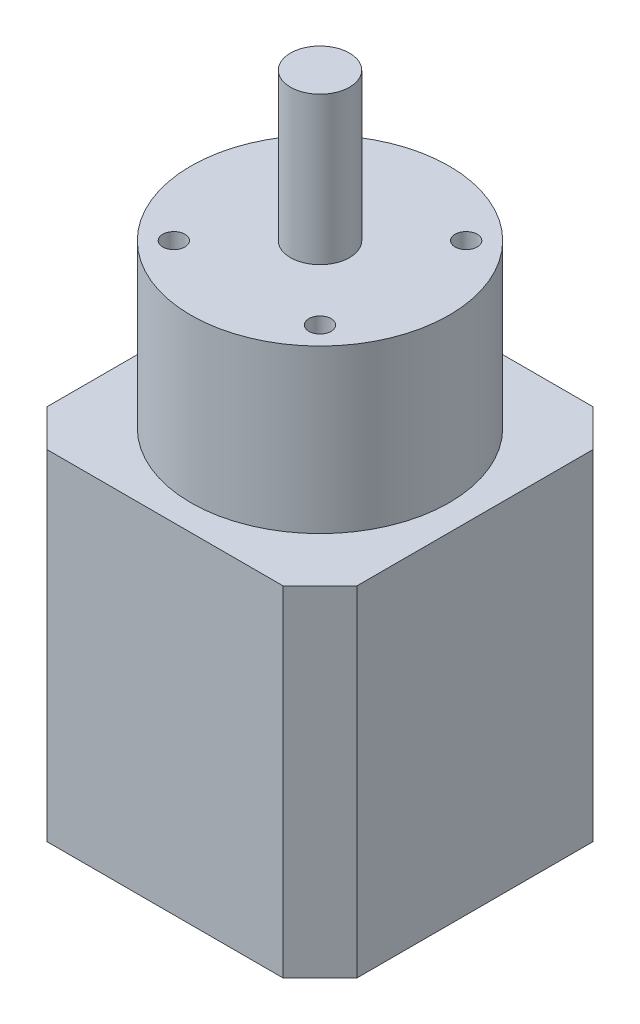
ISO-10303-21;
HEADER;
FILE_DESCRIPTION(('STEP AP214'),'2;1');
FILE_NAME('part.step','',(''),(''),'','','');
FILE_SCHEMA(('AUTOMOTIVE_DESIGN { 1 0 10303 214 1 1 1 1 }'));
ENDSEC;
DATA;
#1=APPLICATION_CONTEXT('core data for automotive mechanical design processes');
#2=APPLICATION_PROTOCOL_DEFINITION('international standard','automotive_design',2000,#1);
#3=PRODUCT_CONTEXT('',#1,'mechanical');
#4=PRODUCT('Part','Part','',(#3));
#5=PRODUCT_RELATED_PRODUCT_CATEGORY('part','',(#4));
#6=PRODUCT_DEFINITION_FORMATION('','',#4);
#7=PRODUCT_DEFINITION_CONTEXT('part definition',#1,'design');
#8=PRODUCT_DEFINITION('design','',#6,#7);
#9=PRODUCT_DEFINITION_SHAPE('','',#8);
#10=(LENGTH_UNIT() NAMED_UNIT(*) SI_UNIT(.MILLI.,.METRE.));
#11=(NAMED_UNIT(*) PLANE_ANGLE_UNIT() SI_UNIT($,.RADIAN.));
#12=(NAMED_UNIT(*) SI_UNIT($,.STERADIAN.) SOLID_ANGLE_UNIT());
#13=UNCERTAINTY_MEASURE_WITH_UNIT(LENGTH_MEASURE(1.E-05),#10,'distance_accuracy_value','');
#14=(GEOMETRIC_REPRESENTATION_CONTEXT(3) GLOBAL_UNCERTAINTY_ASSIGNED_CONTEXT((#13)) GLOBAL_UNIT_ASSIGNED_CONTEXT((#10,
#11,#12)) REPRESENTATION_CONTEXT('',''));
#15=CARTESIAN_POINT('',(0.,0.,0.));
#16=DIRECTION('',(0.,0.,1.));
#17=DIRECTION('',(1.,0.,0.));
#18=AXIS2_PLACEMENT_3D('',#15,#16,#17);
#19=CARTESIAN_POINT('',(0.,68.,0.));
#20=DIRECTION('',(0.,1.,0.));
#21=DIRECTION('',(0.,0.,1.));
#22=AXIS2_PLACEMENT_3D('',#19,#20,#21);
#23=PLANE('',#22);
#24=CARTESIAN_POINT('',(-9.89949493661167,68.,9.89949493661167));
#25=DIRECTION('',(0.,1.,0.));
#26=DIRECTION('',(0.,0.,1.));
#27=AXIS2_PLACEMENT_3D('',#24,#25,#26);
#28=CIRCLE('',#27,1.5);
#29=CARTESIAN_POINT('',(-9.89949493661167,68.,11.3994949366117));
#30=VERTEX_POINT('',#29);
#31=EDGE_CURVE('E211',#30,#30,#28,.T.);
#32=ORIENTED_EDGE('',*,*,#31,.F.);
#33=EDGE_LOOP('',(#32));
#34=FACE_BOUND('',#33,.T.);
#35=CARTESIAN_POINT('',(9.89949493661167,68.,9.89949493661167));
#36=DIRECTION('',(0.,1.,0.));
#37=DIRECTION('',(0.,0.,1.));
#38=AXIS2_PLACEMENT_3D('',#35,#36,#37);
#39=CIRCLE('',#38,1.5);
#40=CARTESIAN_POINT('',(9.89949493661167,68.,11.3994949366117));
#41=VERTEX_POINT('',#40);
#42=EDGE_CURVE('E205',#41,#41,#39,.T.);
#43=ORIENTED_EDGE('',*,*,#42,.F.);
#44=EDGE_LOOP('',(#43));
#45=FACE_BOUND('',#44,.T.);
#46=CARTESIAN_POINT('',(9.89949493661167,68.,-9.89949493661167));
#47=DIRECTION('',(0.,1.,0.));
#48=DIRECTION('',(0.,0.,1.));
#49=AXIS2_PLACEMENT_3D('',#46,#47,#48);
#50=CIRCLE('',#49,1.5);
#51=CARTESIAN_POINT('',(9.89949493661167,68.,-8.39949493661167));
#52=VERTEX_POINT('',#51);
#53=EDGE_CURVE('E199',#52,#52,#50,.T.);
#54=ORIENTED_EDGE('',*,*,#53,.F.);
#55=EDGE_LOOP('',(#54));
#56=FACE_BOUND('',#55,.T.);
#57=CARTESIAN_POINT('',(-9.89949493661167,68.,-9.89949493661167));
#58=DIRECTION('',(0.,1.,0.));
#59=DIRECTION('',(0.,0.,1.));
#60=AXIS2_PLACEMENT_3D('',#57,#58,#59);
#61=CIRCLE('',#60,1.5);
#62=CARTESIAN_POINT('',(-9.89949493661167,68.,-8.39949493661167));
#63=VERTEX_POINT('',#62);
#64=EDGE_CURVE('E193',#63,#63,#61,.T.);
#65=ORIENTED_EDGE('',*,*,#64,.F.);
#66=EDGE_LOOP('',(#65));
#67=FACE_BOUND('',#66,.T.);
#68=CARTESIAN_POINT('',(0.,68.,0.));
#69=DIRECTION('',(0.,1.,0.));
#70=DIRECTION('',(0.,0.,1.));
#71=AXIS2_PLACEMENT_3D('',#68,#69,#70);
#72=CIRCLE('',#71,17.5);
#73=CARTESIAN_POINT('',(0.,68.,17.5));
#74=VERTEX_POINT('',#73);
#75=EDGE_CURVE('E177',#74,#74,#72,.T.);
#76=ORIENTED_EDGE('',*,*,#75,.T.);
#77=EDGE_LOOP('',(#76));
#78=FACE_BOUND('',#77,.T.);
#79=CARTESIAN_POINT('',(0.,68.,0.));
#80=DIRECTION('',(0.,1.,0.));
#81=DIRECTION('',(0.,0.,1.));
#82=AXIS2_PLACEMENT_3D('',#79,#80,#81);
#83=CIRCLE('',#82,4.);
#84=CARTESIAN_POINT('',(0.,68.,4.));
#85=VERTEX_POINT('',#84);
#86=EDGE_CURVE('E186',#85,#85,#83,.T.);
#87=ORIENTED_EDGE('',*,*,#86,.F.);
#88=EDGE_LOOP('',(#87));
#89=FACE_BOUND('',#88,.T.);
#90=ADVANCED_FACE('F34',(#34,#45,#56,#67,#78,#89),#23,.T.);
#91=CARTESIAN_POINT('',(0.,46.,0.));
#92=DIRECTION('',(0.,-1.,0.));
#93=DIRECTION('',(0.,0.,-1.));
#94=AXIS2_PLACEMENT_3D('',#91,#92,#93);
#95=PLANE('',#94);
#96=DIRECTION('',(-1.,0.,0.));
#97=VECTOR('',#96,1.);
#98=CARTESIAN_POINT('',(-21.,46.,-21.));
#99=LINE('',#98,#97);
#100=CARTESIAN_POINT('',(16.,46.,-21.));
#101=VERTEX_POINT('',#100);
#102=CARTESIAN_POINT('',(-16.,46.,-21.));
#103=VERTEX_POINT('',#102);
#104=EDGE_CURVE('E172',#101,#103,#99,.T.);
#105=ORIENTED_EDGE('',*,*,#104,.T.);
#106=DIRECTION('',(0.707106781186549,0.,-0.707106781186546));
#107=VECTOR('',#106,1.);
#108=CARTESIAN_POINT('',(-21.,46.,-16.));
#109=LINE('',#108,#107);
#110=CARTESIAN_POINT('',(-21.,46.,-16.));
#111=VERTEX_POINT('',#110);
#112=EDGE_CURVE('E148',#103,#111,#109,.F.);
#113=ORIENTED_EDGE('',*,*,#112,.T.);
#114=DIRECTION('',(0.,0.,1.));
#115=VECTOR('',#114,1.);
#116=CARTESIAN_POINT('',(-21.,46.,21.));
#117=LINE('',#116,#115);
#118=CARTESIAN_POINT('',(-21.,46.,16.));
#119=VERTEX_POINT('',#118);
#120=EDGE_CURVE('E119',#111,#119,#117,.T.);
#121=ORIENTED_EDGE('',*,*,#120,.T.);
#122=DIRECTION('',(-0.707106781186546,0.,-0.707106781186549));
#123=VECTOR('',#122,1.);
#124=CARTESIAN_POINT('',(-16.,46.,21.));
#125=LINE('',#124,#123);
#126=CARTESIAN_POINT('',(-16.,46.,21.));
#127=VERTEX_POINT('',#126);
#128=EDGE_CURVE('E55',#119,#127,#125,.F.);
#129=ORIENTED_EDGE('',*,*,#128,.T.);
#130=DIRECTION('',(1.,0.,0.));
#131=VECTOR('',#130,1.);
#132=CARTESIAN_POINT('',(-21.,46.,21.));
#133=LINE('',#132,#131);
#134=CARTESIAN_POINT('',(16.,46.,21.));
#135=VERTEX_POINT('',#134);
#136=EDGE_CURVE('E134',#127,#135,#133,.T.);
#137=ORIENTED_EDGE('',*,*,#136,.T.);
#138=DIRECTION('',(-0.707106781186549,0.,0.707106781186547));
#139=VECTOR('',#138,1.);
#140=CARTESIAN_POINT('',(21.,46.,16.));
#141=LINE('',#140,#139);
#142=CARTESIAN_POINT('',(21.,46.,16.));
#143=VERTEX_POINT('',#142);
#144=EDGE_CURVE('E144',#135,#143,#141,.F.);
#145=ORIENTED_EDGE('',*,*,#144,.T.);
#146=DIRECTION('',(0.,0.,-1.));
#147=VECTOR('',#146,1.);
#148=CARTESIAN_POINT('',(21.,46.,21.));
#149=LINE('',#148,#147);
#150=CARTESIAN_POINT('',(21.,46.,-16.));
#151=VERTEX_POINT('',#150);
#152=EDGE_CURVE('E128',#143,#151,#149,.T.);
#153=ORIENTED_EDGE('',*,*,#152,.T.);
#154=DIRECTION('',(0.707106781186547,0.,0.707106781186549));
#155=VECTOR('',#154,1.);
#156=CARTESIAN_POINT('',(16.,46.,-21.));
#157=LINE('',#156,#155);
#158=EDGE_CURVE('E146',#151,#101,#157,.F.);
#159=ORIENTED_EDGE('',*,*,#158,.T.);
#160=EDGE_LOOP('',(#105,#113,#121,#129,#137,#145,#153,#159));
#161=FACE_BOUND('',#160,.T.);
#162=CARTESIAN_POINT('',(0.,46.,0.));
#163=DIRECTION('',(0.,-1.,0.));
#164=DIRECTION('',(0.,0.,-1.));
#165=AXIS2_PLACEMENT_3D('',#162,#163,#164);
#166=CIRCLE('',#165,17.5);
#167=CARTESIAN_POINT('',(0.,46.,-17.5));
#168=VERTEX_POINT('',#167);
#169=EDGE_CURVE('E11',#168,#168,#166,.F.);
#170=ORIENTED_EDGE('',*,*,#169,.F.);
#171=EDGE_LOOP('',(#170));
#172=FACE_BOUND('',#171,.T.);
#173=ADVANCED_FACE('F228',(#161,#172),#95,.F.);
#174=CARTESIAN_POINT('',(21.,46.,21.));
#175=DIRECTION('',(-1.,0.,0.));
#176=DIRECTION('',(0.,0.,1.));
#177=AXIS2_PLACEMENT_3D('',#174,#175,#176);
#178=PLANE('',#177);
#179=DIRECTION('',(0.,0.,-1.));
#180=VECTOR('',#179,1.);
#181=CARTESIAN_POINT('',(21.,0.,21.));
#182=LINE('',#181,#180);
#183=CARTESIAN_POINT('',(21.,0.,16.));
#184=VERTEX_POINT('',#183);
#185=CARTESIAN_POINT('',(21.,0.,-16.));
#186=VERTEX_POINT('',#185);
#187=EDGE_CURVE('E130',#184,#186,#182,.T.);
#188=ORIENTED_EDGE('',*,*,#187,.T.);
#189=DIRECTION('',(0.,1.,0.));
#190=VECTOR('',#189,1.);
#191=CARTESIAN_POINT('',(21.,46.,-16.));
#192=LINE('',#191,#190);
#193=EDGE_CURVE('E153',#186,#151,#192,.T.);
#194=ORIENTED_EDGE('',*,*,#193,.T.);
#195=ORIENTED_EDGE('',*,*,#152,.F.);
#196=DIRECTION('',(0.,-1.,0.));
#197=VECTOR('',#196,1.);
#198=CARTESIAN_POINT('',(21.,46.,16.));
#199=LINE('',#198,#197);
#200=EDGE_CURVE('E150',#143,#184,#199,.T.);
#201=ORIENTED_EDGE('',*,*,#200,.T.);
#202=EDGE_LOOP('',(#188,#194,#195,#201));
#203=FACE_BOUND('',#202,.T.);
#204=ADVANCED_FACE('F168',(#203),#178,.F.);
#205=CARTESIAN_POINT('',(-21.,46.,-21.));
#206=DIRECTION('',(0.,0.,1.));
#207=DIRECTION('',(1.,0.,0.));
#208=AXIS2_PLACEMENT_3D('',#205,#206,#207);
#209=PLANE('',#208);
#210=DIRECTION('',(-1.,0.,0.));
#211=VECTOR('',#210,1.);
#212=CARTESIAN_POINT('',(-21.,0.,-21.));
#213=LINE('',#212,#211);
#214=CARTESIAN_POINT('',(16.,0.,-21.));
#215=VERTEX_POINT('',#214);
#216=CARTESIAN_POINT('',(-16.,0.,-21.));
#217=VERTEX_POINT('',#216);
#218=EDGE_CURVE('E126',#215,#217,#213,.T.);
#219=ORIENTED_EDGE('',*,*,#218,.T.);
#220=DIRECTION('',(0.,1.,0.));
#221=VECTOR('',#220,1.);
#222=CARTESIAN_POINT('',(-16.,46.,-21.));
#223=LINE('',#222,#221);
#224=EDGE_CURVE('E105',#217,#103,#223,.T.);
#225=ORIENTED_EDGE('',*,*,#224,.T.);
#226=ORIENTED_EDGE('',*,*,#104,.F.);
#227=DIRECTION('',(0.,-1.,0.));
#228=VECTOR('',#227,1.);
#229=CARTESIAN_POINT('',(16.,46.,-21.));
#230=LINE('',#229,#228);
#231=EDGE_CURVE('E110',#101,#215,#230,.T.);
#232=ORIENTED_EDGE('',*,*,#231,.T.);
#233=EDGE_LOOP('',(#219,#225,#226,#232));
#234=FACE_BOUND('',#233,.T.);
#235=ADVANCED_FACE('F262',(#234),#209,.F.);
#236=CARTESIAN_POINT('',(-21.,46.,21.));
#237=DIRECTION('',(1.,0.,0.));
#238=DIRECTION('',(0.,0.,-1.));
#239=AXIS2_PLACEMENT_3D('',#236,#237,#238);
#240=PLANE('',#239);
#241=ORIENTED_EDGE('',*,*,#120,.F.);
#242=DIRECTION('',(0.,-1.,0.));
#243=VECTOR('',#242,1.);
#244=CARTESIAN_POINT('',(-21.,46.,-16.));
#245=LINE('',#244,#243);
#246=CARTESIAN_POINT('',(-21.,0.,-16.));
#247=VERTEX_POINT('',#246);
#248=EDGE_CURVE('E104',#111,#247,#245,.T.);
#249=ORIENTED_EDGE('',*,*,#248,.T.);
#250=DIRECTION('',(0.,0.,1.));
#251=VECTOR('',#250,1.);
#252=CARTESIAN_POINT('',(-21.,0.,21.));
#253=LINE('',#252,#251);
#254=CARTESIAN_POINT('',(-21.,0.,16.));
#255=VERTEX_POINT('',#254);
#256=EDGE_CURVE('E117',#247,#255,#253,.T.);
#257=ORIENTED_EDGE('',*,*,#256,.T.);
#258=DIRECTION('',(0.,1.,0.));
#259=VECTOR('',#258,1.);
#260=CARTESIAN_POINT('',(-21.,46.,16.));
#261=LINE('',#260,#259);
#262=EDGE_CURVE('E121',#255,#119,#261,.T.);
#263=ORIENTED_EDGE('',*,*,#262,.T.);
#264=EDGE_LOOP('',(#241,#249,#257,#263));
#265=FACE_BOUND('',#264,.T.);
#266=ADVANCED_FACE('F116',(#265),#240,.F.);
#267=CARTESIAN_POINT('',(-21.,46.,21.));
#268=DIRECTION('',(0.,0.,-1.));
#269=DIRECTION('',(-1.,0.,0.));
#270=AXIS2_PLACEMENT_3D('',#267,#268,#269);
#271=PLANE('',#270);
#272=DIRECTION('',(1.,0.,0.));
#273=VECTOR('',#272,1.);
#274=CARTESIAN_POINT('',(-21.,0.,21.));
#275=LINE('',#274,#273);
#276=CARTESIAN_POINT('',(-16.,0.,21.));
#277=VERTEX_POINT('',#276);
#278=CARTESIAN_POINT('',(16.,0.,21.));
#279=VERTEX_POINT('',#278);
#280=EDGE_CURVE('E125',#277,#279,#275,.T.);
#281=ORIENTED_EDGE('',*,*,#280,.T.);
#282=DIRECTION('',(0.,1.,0.));
#283=VECTOR('',#282,1.);
#284=CARTESIAN_POINT('',(16.,46.,21.));
#285=LINE('',#284,#283);
#286=EDGE_CURVE('E42',#279,#135,#285,.T.);
#287=ORIENTED_EDGE('',*,*,#286,.T.);
#288=ORIENTED_EDGE('',*,*,#136,.F.);
#289=DIRECTION('',(0.,-1.,0.));
#290=VECTOR('',#289,1.);
#291=CARTESIAN_POINT('',(-16.,46.,21.));
#292=LINE('',#291,#290);
#293=EDGE_CURVE('E155',#127,#277,#292,.T.);
#294=ORIENTED_EDGE('',*,*,#293,.T.);
#295=EDGE_LOOP('',(#281,#287,#288,#294));
#296=FACE_BOUND('',#295,.T.);
#297=ADVANCED_FACE('F158',(#296),#271,.F.);
#298=CARTESIAN_POINT('',(0.,0.,0.));
#299=DIRECTION('',(0.,-1.,0.));
#300=DIRECTION('',(0.,0.,-1.));
#301=AXIS2_PLACEMENT_3D('',#298,#299,#300);
#302=PLANE('',#301);
#303=ORIENTED_EDGE('',*,*,#256,.F.);
#304=DIRECTION('',(-0.707106781186549,0.,0.707106781186546));
#305=VECTOR('',#304,1.);
#306=CARTESIAN_POINT('',(-18.5,0.,-18.5));
#307=LINE('',#306,#305);
#308=EDGE_CURVE('E100',#247,#217,#307,.F.);
#309=ORIENTED_EDGE('',*,*,#308,.T.);
#310=ORIENTED_EDGE('',*,*,#218,.F.);
#311=DIRECTION('',(-0.707106781186547,0.,-0.707106781186549));
#312=VECTOR('',#311,1.);
#313=CARTESIAN_POINT('',(18.5,0.,-18.5));
#314=LINE('',#313,#312);
#315=EDGE_CURVE('E111',#215,#186,#314,.F.);
#316=ORIENTED_EDGE('',*,*,#315,.T.);
#317=ORIENTED_EDGE('',*,*,#187,.F.);
#318=DIRECTION('',(0.707106781186549,0.,-0.707106781186547));
#319=VECTOR('',#318,1.);
#320=CARTESIAN_POINT('',(18.5,0.,18.5));
#321=LINE('',#320,#319);
#322=EDGE_CURVE('E137',#184,#279,#321,.F.);
#323=ORIENTED_EDGE('',*,*,#322,.T.);
#324=ORIENTED_EDGE('',*,*,#280,.F.);
#325=DIRECTION('',(0.707106781186546,0.,0.707106781186549));
#326=VECTOR('',#325,1.);
#327=CARTESIAN_POINT('',(-18.5,0.,18.5));
#328=LINE('',#327,#326);
#329=EDGE_CURVE('E120',#277,#255,#328,.F.);
#330=ORIENTED_EDGE('',*,*,#329,.T.);
#331=EDGE_LOOP('',(#303,#309,#310,#316,#317,#323,#324,#330));
#332=FACE_BOUND('',#331,.T.);
#333=ADVANCED_FACE('F123',(#332),#302,.T.);
#334=CARTESIAN_POINT('',(-21.,46.,-16.));
#335=DIRECTION('',(0.707106781186546,0.,0.707106781186549));
#336=DIRECTION('',(0.,-1.,0.));
#337=AXIS2_PLACEMENT_3D('',#334,#335,#336);
#338=PLANE('',#337);
#339=ORIENTED_EDGE('',*,*,#112,.F.);
#340=ORIENTED_EDGE('',*,*,#224,.F.);
#341=ORIENTED_EDGE('',*,*,#308,.F.);
#342=ORIENTED_EDGE('',*,*,#248,.F.);
#343=EDGE_LOOP('',(#339,#340,#341,#342));
#344=FACE_BOUND('',#343,.T.);
#345=ADVANCED_FACE('F103',(#344),#338,.F.);
#346=CARTESIAN_POINT('',(16.,46.,-21.));
#347=DIRECTION('',(-0.707106781186549,0.,0.707106781186547));
#348=DIRECTION('',(0.,-1.,0.));
#349=AXIS2_PLACEMENT_3D('',#346,#347,#348);
#350=PLANE('',#349);
#351=ORIENTED_EDGE('',*,*,#158,.F.);
#352=ORIENTED_EDGE('',*,*,#193,.F.);
#353=ORIENTED_EDGE('',*,*,#315,.F.);
#354=ORIENTED_EDGE('',*,*,#231,.F.);
#355=EDGE_LOOP('',(#351,#352,#353,#354));
#356=FACE_BOUND('',#355,.T.);
#357=ADVANCED_FACE('F270',(#356),#350,.F.);
#358=CARTESIAN_POINT('',(21.,46.,16.));
#359=DIRECTION('',(-0.707106781186547,0.,-0.707106781186549));
#360=DIRECTION('',(0.,-1.,0.));
#361=AXIS2_PLACEMENT_3D('',#358,#359,#360);
#362=PLANE('',#361);
#363=ORIENTED_EDGE('',*,*,#144,.F.);
#364=ORIENTED_EDGE('',*,*,#286,.F.);
#365=ORIENTED_EDGE('',*,*,#322,.F.);
#366=ORIENTED_EDGE('',*,*,#200,.F.);
#367=EDGE_LOOP('',(#363,#364,#365,#366));
#368=FACE_BOUND('',#367,.T.);
#369=ADVANCED_FACE('F165',(#368),#362,.F.);
#370=CARTESIAN_POINT('',(-16.,46.,21.));
#371=DIRECTION('',(0.707106781186549,0.,-0.707106781186546));
#372=DIRECTION('',(0.,-1.,0.));
#373=AXIS2_PLACEMENT_3D('',#370,#371,#372);
#374=PLANE('',#373);
#375=ORIENTED_EDGE('',*,*,#128,.F.);
#376=ORIENTED_EDGE('',*,*,#262,.F.);
#377=ORIENTED_EDGE('',*,*,#329,.F.);
#378=ORIENTED_EDGE('',*,*,#293,.F.);
#379=EDGE_LOOP('',(#375,#376,#377,#378));
#380=FACE_BOUND('',#379,.T.);
#381=ADVANCED_FACE('F36',(#380),#374,.F.);
#382=CARTESIAN_POINT('',(0.,68.,0.));
#383=DIRECTION('',(0.,-1.,0.));
#384=DIRECTION('',(0.,0.,-1.));
#385=AXIS2_PLACEMENT_3D('',#382,#383,#384);
#386=CYLINDRICAL_SURFACE('',#385,17.5);
#387=ORIENTED_EDGE('',*,*,#75,.F.);
#388=EDGE_LOOP('',(#387));
#389=FACE_BOUND('',#388,.T.);
#390=ORIENTED_EDGE('',*,*,#169,.T.);
#391=EDGE_LOOP('',(#390));
#392=FACE_BOUND('',#391,.T.);
#393=ADVANCED_FACE('F241',(#389,#392),#386,.T.);
#394=CARTESIAN_POINT('',(0.,88.,0.));
#395=DIRECTION('',(0.,-1.,0.));
#396=DIRECTION('',(0.,0.,-1.));
#397=AXIS2_PLACEMENT_3D('',#394,#395,#396);
#398=CYLINDRICAL_SURFACE('',#397,4.);
#399=CARTESIAN_POINT('',(0.,88.,0.));
#400=DIRECTION('',(0.,1.,0.));
#401=DIRECTION('',(0.,0.,1.));
#402=AXIS2_PLACEMENT_3D('',#399,#400,#401);
#403=CIRCLE('',#402,4.);
#404=CARTESIAN_POINT('',(0.,88.,4.));
#405=VERTEX_POINT('',#404);
#406=EDGE_CURVE('E182',#405,#405,#403,.T.);
#407=ORIENTED_EDGE('',*,*,#406,.F.);
#408=EDGE_LOOP('',(#407));
#409=FACE_BOUND('',#408,.T.);
#410=ORIENTED_EDGE('',*,*,#86,.T.);
#411=EDGE_LOOP('',(#410));
#412=FACE_BOUND('',#411,.T.);
#413=ADVANCED_FACE('F238',(#409,#412),#398,.T.);
#414=CARTESIAN_POINT('',(0.,88.,0.));
#415=DIRECTION('',(0.,1.,0.));
#416=DIRECTION('',(0.,0.,1.));
#417=AXIS2_PLACEMENT_3D('',#414,#415,#416);
#418=PLANE('',#417);
#419=ORIENTED_EDGE('',*,*,#406,.T.);
#420=EDGE_LOOP('',(#419));
#421=FACE_BOUND('',#420,.T.);
#422=ADVANCED_FACE('F240',(#421),#418,.T.);
#423=CARTESIAN_POINT('',(-9.89949493661167,63.,-9.89949493661167));
#424=DIRECTION('',(0.,1.,0.));
#425=DIRECTION('',(0.,0.,1.));
#426=AXIS2_PLACEMENT_3D('',#423,#424,#425);
#427=CYLINDRICAL_SURFACE('',#426,1.5);
#428=CARTESIAN_POINT('',(-9.89949493661167,63.,-9.89949493661167));
#429=DIRECTION('',(0.,1.,0.));
#430=DIRECTION('',(0.,0.,1.));
#431=AXIS2_PLACEMENT_3D('',#428,#429,#430);
#432=CIRCLE('',#431,1.5);
#433=CARTESIAN_POINT('',(-9.89949493661167,63.,-8.39949493661167));
#434=VERTEX_POINT('',#433);
#435=EDGE_CURVE('E191',#434,#434,#432,.T.);
#436=ORIENTED_EDGE('',*,*,#435,.F.);
#437=EDGE_LOOP('',(#436));
#438=FACE_BOUND('',#437,.T.);
#439=ORIENTED_EDGE('',*,*,#64,.T.);
#440=EDGE_LOOP('',(#439));
#441=FACE_BOUND('',#440,.T.);
#442=ADVANCED_FACE('F248',(#438,#441),#427,.F.);
#443=CARTESIAN_POINT('',(-9.89949493661167,63.,-9.89949493661167));
#444=DIRECTION('',(0.,1.,0.));
#445=DIRECTION('',(0.,0.,1.));
#446=AXIS2_PLACEMENT_3D('',#443,#444,#445);
#447=PLANE('',#446);
#448=ORIENTED_EDGE('',*,*,#435,.T.);
#449=EDGE_LOOP('',(#448));
#450=FACE_BOUND('',#449,.T.);
#451=ADVANCED_FACE('F316',(#450),#447,.T.);
#452=CARTESIAN_POINT('',(9.89949493661167,63.,-9.89949493661167));
#453=DIRECTION('',(0.,1.,0.));
#454=DIRECTION('',(0.,0.,1.));
#455=AXIS2_PLACEMENT_3D('',#452,#453,#454);
#456=CYLINDRICAL_SURFACE('',#455,1.5);
#457=CARTESIAN_POINT('',(9.89949493661167,63.,-9.89949493661167));
#458=DIRECTION('',(0.,1.,0.));
#459=DIRECTION('',(0.,0.,1.));
#460=AXIS2_PLACEMENT_3D('',#457,#458,#459);
#461=CIRCLE('',#460,1.5);
#462=CARTESIAN_POINT('',(9.89949493661167,63.,-8.39949493661167));
#463=VERTEX_POINT('',#462);
#464=EDGE_CURVE('E196',#463,#463,#461,.T.);
#465=ORIENTED_EDGE('',*,*,#464,.F.);
#466=EDGE_LOOP('',(#465));
#467=FACE_BOUND('',#466,.T.);
#468=ORIENTED_EDGE('',*,*,#53,.T.);
#469=EDGE_LOOP('',(#468));
#470=FACE_BOUND('',#469,.T.);
#471=ADVANCED_FACE('F325',(#467,#470),#456,.F.);
#472=CARTESIAN_POINT('',(9.89949493661167,63.,-9.89949493661167));
#473=DIRECTION('',(0.,1.,0.));
#474=DIRECTION('',(0.,0.,1.));
#475=AXIS2_PLACEMENT_3D('',#472,#473,#474);
#476=PLANE('',#475);
#477=ORIENTED_EDGE('',*,*,#464,.T.);
#478=EDGE_LOOP('',(#477));
#479=FACE_BOUND('',#478,.T.);
#480=ADVANCED_FACE('F335',(#479),#476,.T.);
#481=CARTESIAN_POINT('',(9.89949493661167,63.,9.89949493661167));
#482=DIRECTION('',(0.,1.,0.));
#483=DIRECTION('',(0.,0.,1.));
#484=AXIS2_PLACEMENT_3D('',#481,#482,#483);
#485=CYLINDRICAL_SURFACE('',#484,1.5);
#486=CARTESIAN_POINT('',(9.89949493661167,63.,9.89949493661167));
#487=DIRECTION('',(0.,1.,0.));
#488=DIRECTION('',(0.,0.,1.));
#489=AXIS2_PLACEMENT_3D('',#486,#487,#488);
#490=CIRCLE('',#489,1.5);
#491=CARTESIAN_POINT('',(9.89949493661167,63.,11.3994949366117));
#492=VERTEX_POINT('',#491);
#493=EDGE_CURVE('E202',#492,#492,#490,.T.);
#494=ORIENTED_EDGE('',*,*,#493,.F.);
#495=EDGE_LOOP('',(#494));
#496=FACE_BOUND('',#495,.T.);
#497=ORIENTED_EDGE('',*,*,#42,.T.);
#498=EDGE_LOOP('',(#497));
#499=FACE_BOUND('',#498,.T.);
#500=ADVANCED_FACE('F345',(#496,#499),#485,.F.);
#501=CARTESIAN_POINT('',(9.89949493661167,63.,9.89949493661167));
#502=DIRECTION('',(0.,1.,0.));
#503=DIRECTION('',(0.,0.,1.));
#504=AXIS2_PLACEMENT_3D('',#501,#502,#503);
#505=PLANE('',#504);
#506=ORIENTED_EDGE('',*,*,#493,.T.);
#507=EDGE_LOOP('',(#506));
#508=FACE_BOUND('',#507,.T.);
#509=ADVANCED_FACE('F222',(#508),#505,.T.);
#510=CARTESIAN_POINT('',(-9.89949493661167,63.,9.89949493661167));
#511=DIRECTION('',(0.,1.,0.));
#512=DIRECTION('',(0.,0.,1.));
#513=AXIS2_PLACEMENT_3D('',#510,#511,#512);
#514=CYLINDRICAL_SURFACE('',#513,1.5);
#515=CARTESIAN_POINT('',(-9.89949493661167,63.,9.89949493661167));
#516=DIRECTION('',(0.,1.,0.));
#517=DIRECTION('',(0.,0.,1.));
#518=AXIS2_PLACEMENT_3D('',#515,#516,#517);
#519=CIRCLE('',#518,1.5);
#520=CARTESIAN_POINT('',(-9.89949493661167,63.,11.3994949366117));
#521=VERTEX_POINT('',#520);
#522=EDGE_CURVE('E208',#521,#521,#519,.T.);
#523=ORIENTED_EDGE('',*,*,#522,.F.);
#524=EDGE_LOOP('',(#523));
#525=FACE_BOUND('',#524,.T.);
#526=ORIENTED_EDGE('',*,*,#31,.T.);
#527=EDGE_LOOP('',(#526));
#528=FACE_BOUND('',#527,.T.);
#529=ADVANCED_FACE('F219',(#525,#528),#514,.F.);
#530=CARTESIAN_POINT('',(-9.89949493661167,63.,9.89949493661167));
#531=DIRECTION('',(0.,1.,0.));
#532=DIRECTION('',(0.,0.,1.));
#533=AXIS2_PLACEMENT_3D('',#530,#531,#532);
#534=PLANE('',#533);
#535=ORIENTED_EDGE('',*,*,#522,.T.);
#536=EDGE_LOOP('',(#535));
#537=FACE_BOUND('',#536,.T.);
#538=ADVANCED_FACE('F217',(#537),#534,.T.);
#539=CLOSED_SHELL('',(#90,#173,#204,#235,#266,#297,#333,#345,#357,#369,#381,#393,#413,#422,#442,
#451,#471,#480,#500,#509,#529,#538));
#540=MANIFOLD_SOLID_BREP('B2',#539);
#541=ADVANCED_BREP_SHAPE_REPRESENTATION('',(#18,#540),#14);
#542=SHAPE_DEFINITION_REPRESENTATION(#9,#541);
ENDSEC;
END-ISO-10303-21;
